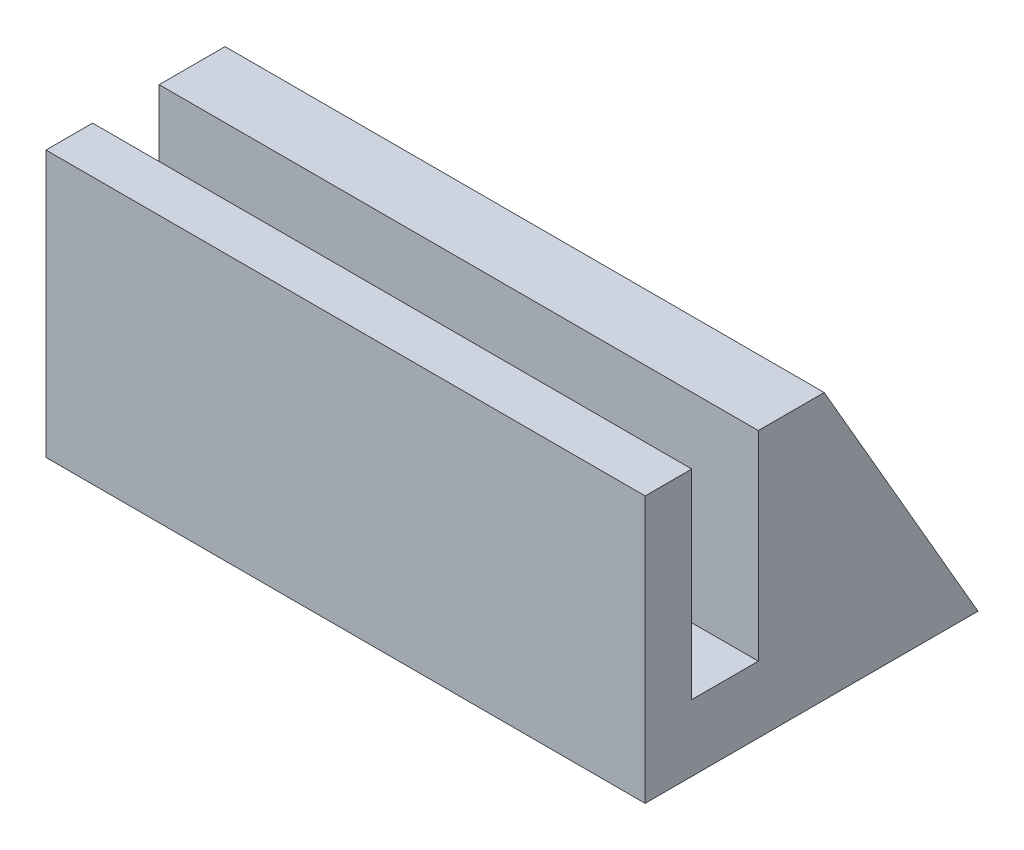
ISO-10303-21;
HEADER;
FILE_DESCRIPTION(('STEP AP214'),'2;1');
FILE_NAME('part.step','',(''),(''),'','','');
FILE_SCHEMA(('AUTOMOTIVE_DESIGN { 1 0 10303 214 1 1 1 1 }'));
ENDSEC;
DATA;
#1=APPLICATION_CONTEXT('core data for automotive mechanical design processes');
#2=APPLICATION_PROTOCOL_DEFINITION('international standard','automotive_design',2000,#1);
#3=PRODUCT_CONTEXT('',#1,'mechanical');
#4=PRODUCT('Part','Part','',(#3));
#5=PRODUCT_RELATED_PRODUCT_CATEGORY('part','',(#4));
#6=PRODUCT_DEFINITION_FORMATION('','',#4);
#7=PRODUCT_DEFINITION_CONTEXT('part definition',#1,'design');
#8=PRODUCT_DEFINITION('design','',#6,#7);
#9=PRODUCT_DEFINITION_SHAPE('','',#8);
#10=(LENGTH_UNIT() NAMED_UNIT(*) SI_UNIT(.MILLI.,.METRE.));
#11=(NAMED_UNIT(*) PLANE_ANGLE_UNIT() SI_UNIT($,.RADIAN.));
#12=(NAMED_UNIT(*) SI_UNIT($,.STERADIAN.) SOLID_ANGLE_UNIT());
#13=UNCERTAINTY_MEASURE_WITH_UNIT(LENGTH_MEASURE(1.E-05),#10,'distance_accuracy_value','');
#14=(GEOMETRIC_REPRESENTATION_CONTEXT(3) GLOBAL_UNCERTAINTY_ASSIGNED_CONTEXT((#13)) GLOBAL_UNIT_ASSIGNED_CONTEXT((#10,
#11,#12)) REPRESENTATION_CONTEXT('',''));
#15=CARTESIAN_POINT('',(0.,0.,0.));
#16=DIRECTION('',(0.,0.,1.));
#17=DIRECTION('',(1.,0.,0.));
#18=AXIS2_PLACEMENT_3D('',#15,#16,#17);
#19=CARTESIAN_POINT('',(22.5,-10.,25.));
#20=DIRECTION('',(-1.,0.,0.));
#21=DIRECTION('',(0.,0.,1.));
#22=AXIS2_PLACEMENT_3D('',#19,#20,#21);
#23=PLANE('',#22);
#24=DIRECTION('',(0.,0.,-1.));
#25=VECTOR('',#24,1.);
#26=CARTESIAN_POINT('',(22.5,-10.,25.));
#27=LINE('',#26,#25);
#28=CARTESIAN_POINT('',(22.5,-10.,25.));
#29=VERTEX_POINT('',#28);
#30=CARTESIAN_POINT('',(22.5,-10.,0.));
#31=VERTEX_POINT('',#30);
#32=EDGE_CURVE('E246',#29,#31,#27,.T.);
#33=ORIENTED_EDGE('',*,*,#32,.T.);
#34=DIRECTION('',(0.,-0.865969252911153,-0.500097243556191));
#35=VECTOR('',#34,1.);
#36=CARTESIAN_POINT('',(22.5,10.,11.55));
#37=LINE('',#36,#35);
#38=CARTESIAN_POINT('',(22.5,10.,11.55));
#39=VERTEX_POINT('',#38);
#40=EDGE_CURVE('E187',#39,#31,#37,.T.);
#41=ORIENTED_EDGE('',*,*,#40,.F.);
#42=DIRECTION('',(0.,0.,-1.));
#43=VECTOR('',#42,1.);
#44=CARTESIAN_POINT('',(22.5,10.,25.));
#45=LINE('',#44,#43);
#46=CARTESIAN_POINT('',(22.5,10.,16.5));
#47=VERTEX_POINT('',#46);
#48=EDGE_CURVE('E261',#47,#39,#45,.T.);
#49=ORIENTED_EDGE('',*,*,#48,.F.);
#50=DIRECTION('',(0.,1.,0.));
#51=VECTOR('',#50,1.);
#52=CARTESIAN_POINT('',(22.5,-5.,16.5));
#53=LINE('',#52,#51);
#54=CARTESIAN_POINT('',(22.5,-5.,16.5));
#55=VERTEX_POINT('',#54);
#56=EDGE_CURVE('E224',#55,#47,#53,.T.);
#57=ORIENTED_EDGE('',*,*,#56,.F.);
#58=DIRECTION('',(0.,0.,-1.));
#59=VECTOR('',#58,1.);
#60=CARTESIAN_POINT('',(22.5,-5.,0.));
#61=LINE('',#60,#59);
#62=CARTESIAN_POINT('',(22.5,-5.,21.5));
#63=VERTEX_POINT('',#62);
#64=EDGE_CURVE('E206',#63,#55,#61,.T.);
#65=ORIENTED_EDGE('',*,*,#64,.F.);
#66=DIRECTION('',(0.,1.,0.));
#67=VECTOR('',#66,1.);
#68=CARTESIAN_POINT('',(22.5,-5.,21.5));
#69=LINE('',#68,#67);
#70=CARTESIAN_POINT('',(22.5,10.,21.5));
#71=VERTEX_POINT('',#70);
#72=EDGE_CURVE('E227',#63,#71,#69,.T.);
#73=ORIENTED_EDGE('',*,*,#72,.T.);
#74=CARTESIAN_POINT('',(22.5,10.,25.));
#75=VERTEX_POINT('',#74);
#76=EDGE_CURVE('E47',#75,#71,#45,.T.);
#77=ORIENTED_EDGE('',*,*,#76,.F.);
#78=DIRECTION('',(0.,1.,0.));
#79=VECTOR('',#78,1.);
#80=CARTESIAN_POINT('',(22.5,-10.,25.));
#81=LINE('',#80,#79);
#82=EDGE_CURVE('E233',#29,#75,#81,.T.);
#83=ORIENTED_EDGE('',*,*,#82,.F.);
#84=EDGE_LOOP('',(#33,#41,#49,#57,#65,#73,#77,#83));
#85=FACE_BOUND('',#84,.T.);
#86=ADVANCED_FACE('F39',(#85),#23,.F.);
#87=CARTESIAN_POINT('',(-22.5,10.,25.));
#88=DIRECTION('',(0.,-1.,0.));
#89=DIRECTION('',(0.,0.,-1.));
#90=AXIS2_PLACEMENT_3D('',#87,#88,#89);
#91=PLANE('',#90);
#92=ORIENTED_EDGE('',*,*,#48,.T.);
#93=DIRECTION('',(1.,0.,0.));
#94=VECTOR('',#93,1.);
#95=CARTESIAN_POINT('',(-45.595508221297,10.,11.55));
#96=LINE('',#95,#94);
#97=CARTESIAN_POINT('',(-22.5,10.,11.55));
#98=VERTEX_POINT('',#97);
#99=EDGE_CURVE('E192',#98,#39,#96,.T.);
#100=ORIENTED_EDGE('',*,*,#99,.F.);
#101=DIRECTION('',(0.,0.,-1.));
#102=VECTOR('',#101,1.);
#103=CARTESIAN_POINT('',(-22.5,10.,25.));
#104=LINE('',#103,#102);
#105=CARTESIAN_POINT('',(-22.5,10.,16.5));
#106=VERTEX_POINT('',#105);
#107=EDGE_CURVE('E257',#106,#98,#104,.T.);
#108=ORIENTED_EDGE('',*,*,#107,.F.);
#109=DIRECTION('',(1.,0.,0.));
#110=VECTOR('',#109,1.);
#111=CARTESIAN_POINT('',(0.,10.,16.5));
#112=LINE('',#111,#110);
#113=EDGE_CURVE('E202',#106,#47,#112,.T.);
#114=ORIENTED_EDGE('',*,*,#113,.T.);
#115=EDGE_LOOP('',(#92,#100,#108,#114));
#116=FACE_BOUND('',#115,.T.);
#117=ADVANCED_FACE('F272',(#116),#91,.F.);
#118=CARTESIAN_POINT('',(-22.5,-10.,25.));
#119=DIRECTION('',(1.,0.,0.));
#120=DIRECTION('',(0.,0.,-1.));
#121=AXIS2_PLACEMENT_3D('',#118,#119,#120);
#122=PLANE('',#121);
#123=ORIENTED_EDGE('',*,*,#107,.T.);
#124=DIRECTION('',(0.,0.865969252911153,0.500097243556191));
#125=VECTOR('',#124,1.);
#126=CARTESIAN_POINT('',(-22.5,10.,11.55));
#127=LINE('',#126,#125);
#128=CARTESIAN_POINT('',(-22.5,-10.,0.));
#129=VERTEX_POINT('',#128);
#130=EDGE_CURVE('E188',#129,#98,#127,.T.);
#131=ORIENTED_EDGE('',*,*,#130,.F.);
#132=DIRECTION('',(0.,0.,-1.));
#133=VECTOR('',#132,1.);
#134=CARTESIAN_POINT('',(-22.5,-10.,25.));
#135=LINE('',#134,#133);
#136=CARTESIAN_POINT('',(-22.5,-10.,25.));
#137=VERTEX_POINT('',#136);
#138=EDGE_CURVE('E253',#137,#129,#135,.T.);
#139=ORIENTED_EDGE('',*,*,#138,.F.);
#140=DIRECTION('',(0.,-1.,0.));
#141=VECTOR('',#140,1.);
#142=CARTESIAN_POINT('',(-22.5,-10.,25.));
#143=LINE('',#142,#141);
#144=CARTESIAN_POINT('',(-22.5,10.,25.));
#145=VERTEX_POINT('',#144);
#146=EDGE_CURVE('E240',#145,#137,#143,.T.);
#147=ORIENTED_EDGE('',*,*,#146,.F.);
#148=CARTESIAN_POINT('',(-22.5,10.,21.5));
#149=VERTEX_POINT('',#148);
#150=EDGE_CURVE('E258',#145,#149,#104,.T.);
#151=ORIENTED_EDGE('',*,*,#150,.T.);
#152=DIRECTION('',(0.,1.,0.));
#153=VECTOR('',#152,1.);
#154=CARTESIAN_POINT('',(-22.5,-5.,21.5));
#155=LINE('',#154,#153);
#156=CARTESIAN_POINT('',(-22.5,-5.,21.5));
#157=VERTEX_POINT('',#156);
#158=EDGE_CURVE('E213',#157,#149,#155,.T.);
#159=ORIENTED_EDGE('',*,*,#158,.F.);
#160=DIRECTION('',(0.,0.,1.));
#161=VECTOR('',#160,1.);
#162=CARTESIAN_POINT('',(-22.5,-5.,0.));
#163=LINE('',#162,#161);
#164=CARTESIAN_POINT('',(-22.5,-5.,16.5));
#165=VERTEX_POINT('',#164);
#166=EDGE_CURVE('E197',#165,#157,#163,.T.);
#167=ORIENTED_EDGE('',*,*,#166,.F.);
#168=DIRECTION('',(0.,1.,0.));
#169=VECTOR('',#168,1.);
#170=CARTESIAN_POINT('',(-22.5,-5.,16.5));
#171=LINE('',#170,#169);
#172=EDGE_CURVE('E219',#165,#106,#171,.T.);
#173=ORIENTED_EDGE('',*,*,#172,.T.);
#174=EDGE_LOOP('',(#123,#131,#139,#147,#151,#159,#167,#173));
#175=FACE_BOUND('',#174,.T.);
#176=ADVANCED_FACE('F290',(#175),#122,.F.);
#177=ORIENTED_EDGE('',*,*,#76,.T.);
#178=DIRECTION('',(1.,0.,0.));
#179=VECTOR('',#178,1.);
#180=CARTESIAN_POINT('',(0.,10.,21.5));
#181=LINE('',#180,#179);
#182=EDGE_CURVE('E191',#149,#71,#181,.T.);
#183=ORIENTED_EDGE('',*,*,#182,.F.);
#184=ORIENTED_EDGE('',*,*,#150,.F.);
#185=DIRECTION('',(-1.,0.,0.));
#186=VECTOR('',#185,1.);
#187=CARTESIAN_POINT('',(-22.5,10.,25.));
#188=LINE('',#187,#186);
#189=EDGE_CURVE('E237',#75,#145,#188,.T.);
#190=ORIENTED_EDGE('',*,*,#189,.F.);
#191=EDGE_LOOP('',(#177,#183,#184,#190));
#192=FACE_BOUND('',#191,.T.);
#193=ADVANCED_FACE('F302',(#192),#91,.F.);
#194=CARTESIAN_POINT('',(-22.5,-10.,25.));
#195=DIRECTION('',(0.,1.,0.));
#196=DIRECTION('',(0.,0.,1.));
#197=AXIS2_PLACEMENT_3D('',#194,#195,#196);
#198=PLANE('',#197);
#199=DIRECTION('',(-1.,0.,0.));
#200=VECTOR('',#199,1.);
#201=CARTESIAN_POINT('',(-22.5,-10.,7.71788402924451));
#202=LINE('',#201,#200);
#203=CARTESIAN_POINT('',(19.15,-10.,7.71788402924451));
#204=VERTEX_POINT('',#203);
#205=CARTESIAN_POINT('',(-19.15,-10.,7.71788402924451));
#206=VERTEX_POINT('',#205);
#207=EDGE_CURVE('E180',#204,#206,#202,.T.);
#208=ORIENTED_EDGE('',*,*,#207,.T.);
#209=DIRECTION('',(0.,0.,1.));
#210=VECTOR('',#209,1.);
#211=CARTESIAN_POINT('',(-19.15,-10.,25.));
#212=LINE('',#211,#210);
#213=CARTESIAN_POINT('',(-19.15,-10.,11.5477541106485));
#214=VERTEX_POINT('',#213);
#215=EDGE_CURVE('E184',#206,#214,#212,.T.);
#216=ORIENTED_EDGE('',*,*,#215,.T.);
#217=DIRECTION('',(1.,0.,0.));
#218=VECTOR('',#217,1.);
#219=CARTESIAN_POINT('',(-22.5,-10.,11.5477541106485));
#220=LINE('',#219,#218);
#221=CARTESIAN_POINT('',(19.15,-10.,11.5477541106485));
#222=VERTEX_POINT('',#221);
#223=EDGE_CURVE('E11',#214,#222,#220,.T.);
#224=ORIENTED_EDGE('',*,*,#223,.T.);
#225=DIRECTION('',(0.,0.,-1.));
#226=VECTOR('',#225,1.);
#227=CARTESIAN_POINT('',(19.15,-10.,25.));
#228=LINE('',#227,#226);
#229=EDGE_CURVE('E171',#222,#204,#228,.T.);
#230=ORIENTED_EDGE('',*,*,#229,.T.);
#231=EDGE_LOOP('',(#208,#216,#224,#230));
#232=FACE_BOUND('',#231,.T.);
#233=DIRECTION('',(1.,0.,0.));
#234=VECTOR('',#233,1.);
#235=CARTESIAN_POINT('',(-22.5,-10.,0.));
#236=LINE('',#235,#234);
#237=EDGE_CURVE('E223',#129,#31,#236,.T.);
#238=ORIENTED_EDGE('',*,*,#237,.T.);
#239=ORIENTED_EDGE('',*,*,#32,.F.);
#240=DIRECTION('',(1.,0.,0.));
#241=VECTOR('',#240,1.);
#242=CARTESIAN_POINT('',(-22.5,-10.,25.));
#243=LINE('',#242,#241);
#244=EDGE_CURVE('E243',#137,#29,#243,.T.);
#245=ORIENTED_EDGE('',*,*,#244,.F.);
#246=ORIENTED_EDGE('',*,*,#138,.T.);
#247=EDGE_LOOP('',(#238,#239,#245,#246));
#248=FACE_BOUND('',#247,.T.);
#249=ADVANCED_FACE('F285',(#232,#248),#198,.F.);
#250=CARTESIAN_POINT('',(0.,0.,25.));
#251=DIRECTION('',(0.,0.,-1.));
#252=DIRECTION('',(-1.,0.,0.));
#253=AXIS2_PLACEMENT_3D('',#250,#251,#252);
#254=PLANE('',#253);
#255=ORIENTED_EDGE('',*,*,#82,.T.);
#256=ORIENTED_EDGE('',*,*,#189,.T.);
#257=ORIENTED_EDGE('',*,*,#146,.T.);
#258=ORIENTED_EDGE('',*,*,#244,.T.);
#259=EDGE_LOOP('',(#255,#256,#257,#258));
#260=FACE_BOUND('',#259,.T.);
#261=ADVANCED_FACE('F304',(#260),#254,.F.);
#262=CARTESIAN_POINT('',(0.,-5.,16.5));
#263=DIRECTION('',(0.,0.,1.));
#264=DIRECTION('',(1.,0.,0.));
#265=AXIS2_PLACEMENT_3D('',#262,#263,#264);
#266=PLANE('',#265);
#267=ORIENTED_EDGE('',*,*,#113,.F.);
#268=ORIENTED_EDGE('',*,*,#172,.F.);
#269=DIRECTION('',(1.,0.,0.));
#270=VECTOR('',#269,1.);
#271=CARTESIAN_POINT('',(0.,-5.,16.5));
#272=LINE('',#271,#270);
#273=EDGE_CURVE('E210',#165,#55,#272,.T.);
#274=ORIENTED_EDGE('',*,*,#273,.T.);
#275=ORIENTED_EDGE('',*,*,#56,.T.);
#276=EDGE_LOOP('',(#267,#268,#274,#275));
#277=FACE_BOUND('',#276,.T.);
#278=ADVANCED_FACE('F296',(#277),#266,.T.);
#279=CARTESIAN_POINT('',(0.,-5.,21.5));
#280=DIRECTION('',(0.,0.,1.));
#281=DIRECTION('',(1.,0.,0.));
#282=AXIS2_PLACEMENT_3D('',#279,#280,#281);
#283=PLANE('',#282);
#284=ORIENTED_EDGE('',*,*,#182,.T.);
#285=ORIENTED_EDGE('',*,*,#72,.F.);
#286=DIRECTION('',(1.,0.,0.));
#287=VECTOR('',#286,1.);
#288=CARTESIAN_POINT('',(0.,-5.,21.5));
#289=LINE('',#288,#287);
#290=EDGE_CURVE('E201',#157,#63,#289,.T.);
#291=ORIENTED_EDGE('',*,*,#290,.F.);
#292=ORIENTED_EDGE('',*,*,#158,.T.);
#293=EDGE_LOOP('',(#284,#285,#291,#292));
#294=FACE_BOUND('',#293,.T.);
#295=ADVANCED_FACE('F300',(#294),#283,.F.);
#296=CARTESIAN_POINT('',(0.,-5.,0.));
#297=DIRECTION('',(0.,1.,0.));
#298=DIRECTION('',(0.,0.,1.));
#299=AXIS2_PLACEMENT_3D('',#296,#297,#298);
#300=PLANE('',#299);
#301=ORIENTED_EDGE('',*,*,#166,.T.);
#302=ORIENTED_EDGE('',*,*,#290,.T.);
#303=ORIENTED_EDGE('',*,*,#64,.T.);
#304=ORIENTED_EDGE('',*,*,#273,.F.);
#305=EDGE_LOOP('',(#301,#302,#303,#304));
#306=FACE_BOUND('',#305,.T.);
#307=ADVANCED_FACE('F298',(#306),#300,.T.);
#308=CARTESIAN_POINT('',(-45.595508221297,10.,11.55));
#309=DIRECTION('',(0.,-0.500097243556191,0.865969252911153));
#310=DIRECTION('',(0.,-0.865969252911153,-0.500097243556191));
#311=AXIS2_PLACEMENT_3D('',#308,#309,#310);
#312=PLANE('',#311);
#313=DIRECTION('',(1.,0.,0.));
#314=VECTOR('',#313,1.);
#315=CARTESIAN_POINT('',(19.15,1.65567988384853,6.73115513292253));
#316=LINE('',#315,#314);
#317=CARTESIAN_POINT('',(-19.15,1.65567988384853,6.73115513292253));
#318=VERTEX_POINT('',#317);
#319=CARTESIAN_POINT('',(19.15,1.65567988384853,6.73115513292253));
#320=VERTEX_POINT('',#319);
#321=EDGE_CURVE('E158',#318,#320,#316,.T.);
#322=ORIENTED_EDGE('',*,*,#321,.F.);
#323=DIRECTION('',(0.,0.865969252911153,0.500097243556191));
#324=VECTOR('',#323,1.);
#325=CARTESIAN_POINT('',(-19.15,-6.65762494409853,1.9302215947831));
#326=LINE('',#325,#324);
#327=CARTESIAN_POINT('',(-19.15,-6.65762494409853,1.9302215947831));
#328=VERTEX_POINT('',#327);
#329=EDGE_CURVE('E62',#328,#318,#326,.T.);
#330=ORIENTED_EDGE('',*,*,#329,.F.);
#331=DIRECTION('',(-1.,0.,0.));
#332=VECTOR('',#331,1.);
#333=CARTESIAN_POINT('',(19.15,-6.65762494409853,1.9302215947831));
#334=LINE('',#333,#332);
#335=CARTESIAN_POINT('',(19.15,-6.65762494409853,1.9302215947831));
#336=VERTEX_POINT('',#335);
#337=EDGE_CURVE('E140',#336,#328,#334,.T.);
#338=ORIENTED_EDGE('',*,*,#337,.F.);
#339=DIRECTION('',(0.,-0.865969252911153,-0.500097243556191));
#340=VECTOR('',#339,1.);
#341=CARTESIAN_POINT('',(19.15,-6.65762494409853,1.9302215947831));
#342=LINE('',#341,#340);
#343=EDGE_CURVE('E161',#320,#336,#342,.T.);
#344=ORIENTED_EDGE('',*,*,#343,.F.);
#345=EDGE_LOOP('',(#322,#330,#338,#344));
#346=FACE_BOUND('',#345,.T.);
#347=ORIENTED_EDGE('',*,*,#130,.T.);
#348=ORIENTED_EDGE('',*,*,#99,.T.);
#349=ORIENTED_EDGE('',*,*,#40,.T.);
#350=ORIENTED_EDGE('',*,*,#237,.F.);
#351=EDGE_LOOP('',(#347,#348,#349,#350));
#352=FACE_BOUND('',#351,.T.);
#353=ADVANCED_FACE('F282',(#346,#352),#312,.F.);
#354=CARTESIAN_POINT('',(0.,-7.50194496568691,12.9903808929643));
#355=DIRECTION('',(0.,-0.500097243556191,0.865969252911153));
#356=DIRECTION('',(0.,-0.865969252911153,-0.500097243556191));
#357=AXIS2_PLACEMENT_3D('',#354,#355,#356);
#358=PLANE('',#357);
#359=DIRECTION('',(0.,0.865969252911153,0.500097243556191));
#360=VECTOR('',#359,1.);
#361=CARTESIAN_POINT('',(-19.15,-11.6585973796604,10.5899141238946));
#362=LINE('',#361,#360);
#363=CARTESIAN_POINT('',(-19.15,-3.34529255171338,15.3908476620341));
#364=VERTEX_POINT('',#363);
#365=EDGE_CURVE('E134',#214,#364,#362,.T.);
#366=ORIENTED_EDGE('',*,*,#365,.T.);
#367=DIRECTION('',(1.,0.,0.));
#368=VECTOR('',#367,1.);
#369=CARTESIAN_POINT('',(19.15,-3.34529255171338,15.3908476620341));
#370=LINE('',#369,#368);
#371=CARTESIAN_POINT('',(19.15,-3.34529255171338,15.3908476620341));
#372=VERTEX_POINT('',#371);
#373=EDGE_CURVE('E137',#364,#372,#370,.T.);
#374=ORIENTED_EDGE('',*,*,#373,.T.);
#375=DIRECTION('',(0.,-0.865969252911153,-0.500097243556191));
#376=VECTOR('',#375,1.);
#377=CARTESIAN_POINT('',(19.15,-11.6585973796604,10.5899141238946));
#378=LINE('',#377,#376);
#379=EDGE_CURVE('E54',#372,#222,#378,.T.);
#380=ORIENTED_EDGE('',*,*,#379,.T.);
#381=ORIENTED_EDGE('',*,*,#223,.F.);
#382=EDGE_LOOP('',(#366,#374,#380,#381));
#383=FACE_BOUND('',#382,.T.);
#384=ADVANCED_FACE('F135',(#383),#358,.F.);
#385=CARTESIAN_POINT('',(-19.15,-11.6585973796604,10.5899141238946));
#386=DIRECTION('',(-1.,0.,0.));
#387=DIRECTION('',(0.,0.,1.));
#388=AXIS2_PLACEMENT_3D('',#385,#386,#387);
#389=PLANE('',#388);
#390=DIRECTION('',(0.,0.500097243556191,-0.865969252911153));
#391=VECTOR('',#390,1.);
#392=CARTESIAN_POINT('',(-19.15,-11.6585973796604,10.5899141238946));
#393=LINE('',#392,#391);
#394=EDGE_CURVE('E168',#206,#328,#393,.T.);
#395=ORIENTED_EDGE('',*,*,#394,.T.);
#396=ORIENTED_EDGE('',*,*,#329,.T.);
#397=DIRECTION('',(0.,0.500097243556191,-0.865969252911153));
#398=VECTOR('',#397,1.);
#399=CARTESIAN_POINT('',(-19.15,-3.34529255171338,15.3908476620341));
#400=LINE('',#399,#398);
#401=EDGE_CURVE('E142',#364,#318,#400,.T.);
#402=ORIENTED_EDGE('',*,*,#401,.F.);
#403=ORIENTED_EDGE('',*,*,#365,.F.);
#404=ORIENTED_EDGE('',*,*,#215,.F.);
#405=EDGE_LOOP('',(#395,#396,#402,#403,#404));
#406=FACE_BOUND('',#405,.T.);
#407=ADVANCED_FACE('F143',(#406),#389,.F.);
#408=CARTESIAN_POINT('',(19.15,-11.6585973796604,10.5899141238946));
#409=DIRECTION('',(0.,-0.865969252911153,-0.500097243556191));
#410=DIRECTION('',(0.,0.500097243556191,-0.865969252911153));
#411=AXIS2_PLACEMENT_3D('',#408,#409,#410);
#412=PLANE('',#411);
#413=DIRECTION('',(0.,0.500097243556191,-0.865969252911153));
#414=VECTOR('',#413,1.);
#415=CARTESIAN_POINT('',(19.15,-11.6585973796604,10.5899141238946));
#416=LINE('',#415,#414);
#417=EDGE_CURVE('E172',#204,#336,#416,.T.);
#418=ORIENTED_EDGE('',*,*,#417,.T.);
#419=ORIENTED_EDGE('',*,*,#337,.T.);
#420=ORIENTED_EDGE('',*,*,#394,.F.);
#421=ORIENTED_EDGE('',*,*,#207,.F.);
#422=EDGE_LOOP('',(#418,#419,#420,#421));
#423=FACE_BOUND('',#422,.T.);
#424=ADVANCED_FACE('F364',(#423),#412,.F.);
#425=CARTESIAN_POINT('',(19.15,-11.6585973796604,10.5899141238946));
#426=DIRECTION('',(1.,0.,0.));
#427=DIRECTION('',(0.,0.,-1.));
#428=AXIS2_PLACEMENT_3D('',#425,#426,#427);
#429=PLANE('',#428);
#430=ORIENTED_EDGE('',*,*,#379,.F.);
#431=DIRECTION('',(0.,0.500097243556191,-0.865969252911153));
#432=VECTOR('',#431,1.);
#433=CARTESIAN_POINT('',(19.15,-3.34529255171338,15.3908476620341));
#434=LINE('',#433,#432);
#435=EDGE_CURVE('E148',#372,#320,#434,.T.);
#436=ORIENTED_EDGE('',*,*,#435,.T.);
#437=ORIENTED_EDGE('',*,*,#343,.T.);
#438=ORIENTED_EDGE('',*,*,#417,.F.);
#439=ORIENTED_EDGE('',*,*,#229,.F.);
#440=EDGE_LOOP('',(#430,#436,#437,#438,#439));
#441=FACE_BOUND('',#440,.T.);
#442=ADVANCED_FACE('F373',(#441),#429,.F.);
#443=CARTESIAN_POINT('',(19.15,-3.34529255171338,15.3908476620341));
#444=DIRECTION('',(0.,0.865969252911153,0.500097243556191));
#445=DIRECTION('',(0.,-0.500097243556191,0.865969252911153));
#446=AXIS2_PLACEMENT_3D('',#443,#444,#445);
#447=PLANE('',#446);
#448=ORIENTED_EDGE('',*,*,#321,.T.);
#449=ORIENTED_EDGE('',*,*,#435,.F.);
#450=ORIENTED_EDGE('',*,*,#373,.F.);
#451=ORIENTED_EDGE('',*,*,#401,.T.);
#452=EDGE_LOOP('',(#448,#449,#450,#451));
#453=FACE_BOUND('',#452,.T.);
#454=ADVANCED_FACE('F150',(#453),#447,.F.);
#455=CLOSED_SHELL('',(#86,#117,#176,#193,#249,#261,#278,#295,#307,#353,#384,#407,#424,#442,#454));
#456=MANIFOLD_SOLID_BREP('B2',#455);
#457=ADVANCED_BREP_SHAPE_REPRESENTATION('',(#18,#456),#14);
#458=SHAPE_DEFINITION_REPRESENTATION(#9,#457);
ENDSEC;
END-ISO-10303-21;
